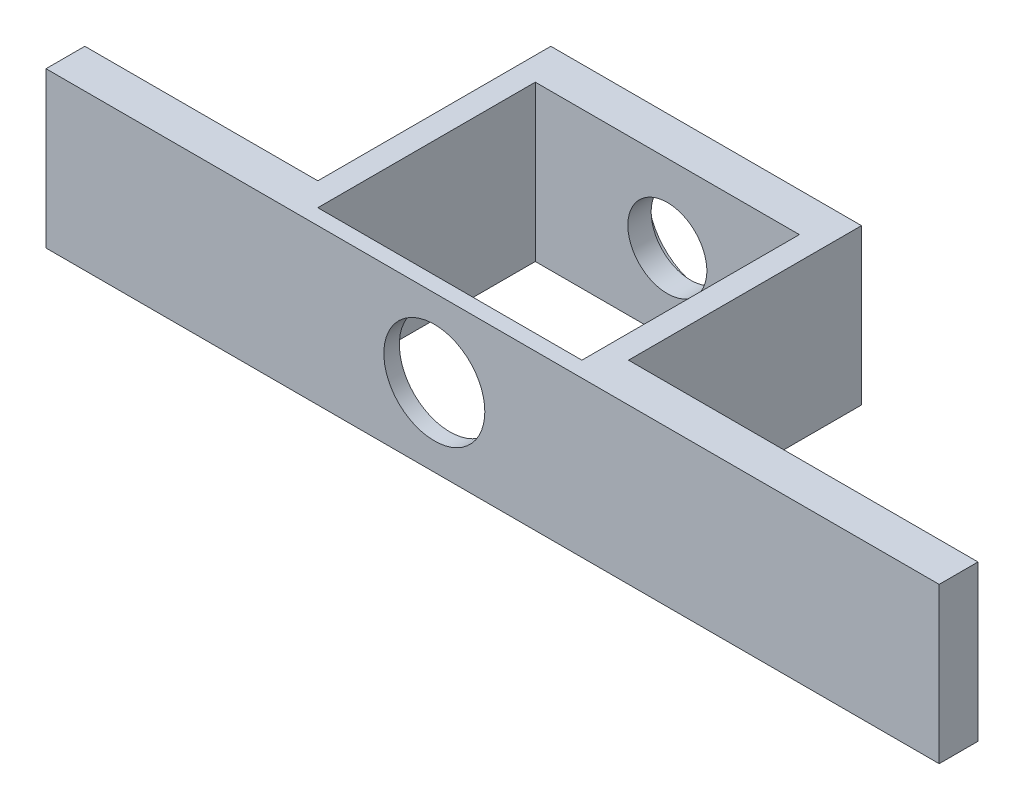
ISO-10303-21;
HEADER;
FILE_DESCRIPTION(('STEP AP214'),'2;1');
FILE_NAME('part.step','',(''),(''),'','','');
FILE_SCHEMA(('AUTOMOTIVE_DESIGN { 1 0 10303 214 1 1 1 1 }'));
ENDSEC;
DATA;
#1=APPLICATION_CONTEXT('core data for automotive mechanical design processes');
#2=APPLICATION_PROTOCOL_DEFINITION('international standard','automotive_design',2000,#1);
#3=PRODUCT_CONTEXT('',#1,'mechanical');
#4=PRODUCT('Part','Part','',(#3));
#5=PRODUCT_RELATED_PRODUCT_CATEGORY('part','',(#4));
#6=PRODUCT_DEFINITION_FORMATION('','',#4);
#7=PRODUCT_DEFINITION_CONTEXT('part definition',#1,'design');
#8=PRODUCT_DEFINITION('design','',#6,#7);
#9=PRODUCT_DEFINITION_SHAPE('','',#8);
#10=(LENGTH_UNIT() NAMED_UNIT(*) SI_UNIT(.MILLI.,.METRE.));
#11=(NAMED_UNIT(*) PLANE_ANGLE_UNIT() SI_UNIT($,.RADIAN.));
#12=(NAMED_UNIT(*) SI_UNIT($,.STERADIAN.) SOLID_ANGLE_UNIT());
#13=UNCERTAINTY_MEASURE_WITH_UNIT(LENGTH_MEASURE(1.E-05),#10,'distance_accuracy_value','');
#14=(GEOMETRIC_REPRESENTATION_CONTEXT(3) GLOBAL_UNCERTAINTY_ASSIGNED_CONTEXT((#13)) GLOBAL_UNIT_ASSIGNED_CONTEXT((#10,
#11,#12)) REPRESENTATION_CONTEXT('',''));
#15=CARTESIAN_POINT('',(0.,0.,0.));
#16=DIRECTION('',(0.,0.,1.));
#17=DIRECTION('',(1.,0.,0.));
#18=AXIS2_PLACEMENT_3D('',#15,#16,#17);
#19=CARTESIAN_POINT('',(-17.,10.,35.));
#20=DIRECTION('',(-1.,0.,0.));
#21=DIRECTION('',(0.,-1.,0.));
#22=AXIS2_PLACEMENT_3D('',#19,#20,#21);
#23=PLANE('',#22);
#24=DIRECTION('',(0.,-1.,0.));
#25=VECTOR('',#24,1.);
#26=CARTESIAN_POINT('',(-17.,10.,33.));
#27=LINE('',#26,#25);
#28=CARTESIAN_POINT('',(-17.,10.,33.));
#29=VERTEX_POINT('',#28);
#30=CARTESIAN_POINT('',(-17.,-10.,33.));
#31=VERTEX_POINT('',#30);
#32=EDGE_CURVE('E126',#29,#31,#27,.T.);
#33=ORIENTED_EDGE('',*,*,#32,.T.);
#34=DIRECTION('',(0.,0.,-1.));
#35=VECTOR('',#34,1.);
#36=CARTESIAN_POINT('',(-17.,-10.,35.));
#37=LINE('',#36,#35);
#38=CARTESIAN_POINT('',(-17.,-10.,5.));
#39=VERTEX_POINT('',#38);
#40=EDGE_CURVE('E137',#31,#39,#37,.T.);
#41=ORIENTED_EDGE('',*,*,#40,.T.);
#42=DIRECTION('',(0.,1.,0.));
#43=VECTOR('',#42,1.);
#44=CARTESIAN_POINT('',(-17.,10.,5.));
#45=LINE('',#44,#43);
#46=CARTESIAN_POINT('',(-17.,10.,5.));
#47=VERTEX_POINT('',#46);
#48=EDGE_CURVE('E229',#39,#47,#45,.T.);
#49=ORIENTED_EDGE('',*,*,#48,.T.);
#50=DIRECTION('',(0.,0.,-1.));
#51=VECTOR('',#50,1.);
#52=CARTESIAN_POINT('',(-17.,10.,35.));
#53=LINE('',#52,#51);
#54=EDGE_CURVE('E139',#29,#47,#53,.T.);
#55=ORIENTED_EDGE('',*,*,#54,.F.);
#56=EDGE_LOOP('',(#33,#41,#49,#55));
#57=FACE_BOUND('',#56,.T.);
#58=ADVANCED_FACE('F35',(#57),#23,.F.);
#59=CARTESIAN_POINT('',(17.,10.,35.));
#60=DIRECTION('',(1.,0.,0.));
#61=DIRECTION('',(0.,1.,0.));
#62=AXIS2_PLACEMENT_3D('',#59,#60,#61);
#63=PLANE('',#62);
#64=DIRECTION('',(0.,1.,0.));
#65=VECTOR('',#64,1.);
#66=CARTESIAN_POINT('',(17.,10.,33.));
#67=LINE('',#66,#65);
#68=CARTESIAN_POINT('',(17.,-10.,33.));
#69=VERTEX_POINT('',#68);
#70=CARTESIAN_POINT('',(17.,10.,33.));
#71=VERTEX_POINT('',#70);
#72=EDGE_CURVE('E129',#69,#71,#67,.T.);
#73=ORIENTED_EDGE('',*,*,#72,.T.);
#74=DIRECTION('',(0.,0.,-1.));
#75=VECTOR('',#74,1.);
#76=CARTESIAN_POINT('',(17.,10.,35.));
#77=LINE('',#76,#75);
#78=CARTESIAN_POINT('',(17.,10.,5.));
#79=VERTEX_POINT('',#78);
#80=EDGE_CURVE('E227',#71,#79,#77,.T.);
#81=ORIENTED_EDGE('',*,*,#80,.T.);
#82=DIRECTION('',(0.,-1.,0.));
#83=VECTOR('',#82,1.);
#84=CARTESIAN_POINT('',(17.,10.,5.));
#85=LINE('',#84,#83);
#86=CARTESIAN_POINT('',(17.,-10.,5.));
#87=VERTEX_POINT('',#86);
#88=EDGE_CURVE('E222',#79,#87,#85,.T.);
#89=ORIENTED_EDGE('',*,*,#88,.T.);
#90=DIRECTION('',(0.,0.,-1.));
#91=VECTOR('',#90,1.);
#92=CARTESIAN_POINT('',(17.,-10.,35.));
#93=LINE('',#92,#91);
#94=EDGE_CURVE('E225',#69,#87,#93,.T.);
#95=ORIENTED_EDGE('',*,*,#94,.F.);
#96=EDGE_LOOP('',(#73,#81,#89,#95));
#97=FACE_BOUND('',#96,.T.);
#98=ADVANCED_FACE('F239',(#97),#63,.F.);
#99=CARTESIAN_POINT('',(-20.,-10.,5.));
#100=DIRECTION('',(1.,0.,0.));
#101=DIRECTION('',(0.,0.,-1.));
#102=AXIS2_PLACEMENT_3D('',#99,#100,#101);
#103=PLANE('',#102);
#104=DIRECTION('',(0.,-1.,0.));
#105=VECTOR('',#104,1.);
#106=CARTESIAN_POINT('',(-20.,10.,30.));
#107=LINE('',#106,#105);
#108=CARTESIAN_POINT('',(-20.,10.,30.));
#109=VERTEX_POINT('',#108);
#110=CARTESIAN_POINT('',(-20.,-10.,30.));
#111=VERTEX_POINT('',#110);
#112=EDGE_CURVE('E51',#109,#111,#107,.T.);
#113=ORIENTED_EDGE('',*,*,#112,.F.);
#114=DIRECTION('',(0.,0.,-1.));
#115=VECTOR('',#114,1.);
#116=CARTESIAN_POINT('',(-20.,10.,5.));
#117=LINE('',#116,#115);
#118=CARTESIAN_POINT('',(-20.,10.,0.));
#119=VERTEX_POINT('',#118);
#120=EDGE_CURVE('E44',#109,#119,#117,.T.);
#121=ORIENTED_EDGE('',*,*,#120,.T.);
#122=DIRECTION('',(0.,-1.,0.));
#123=VECTOR('',#122,1.);
#124=CARTESIAN_POINT('',(-20.,-10.,0.));
#125=LINE('',#124,#123);
#126=CARTESIAN_POINT('',(-20.,-10.,0.));
#127=VERTEX_POINT('',#126);
#128=EDGE_CURVE('E164',#119,#127,#125,.T.);
#129=ORIENTED_EDGE('',*,*,#128,.T.);
#130=DIRECTION('',(0.,0.,-1.));
#131=VECTOR('',#130,1.);
#132=CARTESIAN_POINT('',(-20.,-10.,5.));
#133=LINE('',#132,#131);
#134=EDGE_CURVE('E170',#111,#127,#133,.T.);
#135=ORIENTED_EDGE('',*,*,#134,.F.);
#136=EDGE_LOOP('',(#113,#121,#129,#135));
#137=FACE_BOUND('',#136,.T.);
#138=ADVANCED_FACE('F172',(#137),#103,.F.);
#139=CARTESIAN_POINT('',(20.,-10.,5.));
#140=DIRECTION('',(-1.,0.,0.));
#141=DIRECTION('',(0.,0.,1.));
#142=AXIS2_PLACEMENT_3D('',#139,#140,#141);
#143=PLANE('',#142);
#144=DIRECTION('',(0.,1.,0.));
#145=VECTOR('',#144,1.);
#146=CARTESIAN_POINT('',(20.,10.,30.));
#147=LINE('',#146,#145);
#148=CARTESIAN_POINT('',(20.,-10.,30.));
#149=VERTEX_POINT('',#148);
#150=CARTESIAN_POINT('',(20.,10.,30.));
#151=VERTEX_POINT('',#150);
#152=EDGE_CURVE('E59',#149,#151,#147,.T.);
#153=ORIENTED_EDGE('',*,*,#152,.F.);
#154=DIRECTION('',(0.,0.,-1.));
#155=VECTOR('',#154,1.);
#156=CARTESIAN_POINT('',(20.,-10.,5.));
#157=LINE('',#156,#155);
#158=CARTESIAN_POINT('',(20.,-10.,0.));
#159=VERTEX_POINT('',#158);
#160=EDGE_CURVE('E160',#149,#159,#157,.T.);
#161=ORIENTED_EDGE('',*,*,#160,.T.);
#162=DIRECTION('',(0.,1.,0.));
#163=VECTOR('',#162,1.);
#164=CARTESIAN_POINT('',(20.,-10.,0.));
#165=LINE('',#164,#163);
#166=CARTESIAN_POINT('',(20.,10.,0.));
#167=VERTEX_POINT('',#166);
#168=EDGE_CURVE('E147',#159,#167,#165,.T.);
#169=ORIENTED_EDGE('',*,*,#168,.T.);
#170=DIRECTION('',(0.,0.,-1.));
#171=VECTOR('',#170,1.);
#172=CARTESIAN_POINT('',(20.,10.,5.));
#173=LINE('',#172,#171);
#174=EDGE_CURVE('E11',#151,#167,#173,.T.);
#175=ORIENTED_EDGE('',*,*,#174,.F.);
#176=EDGE_LOOP('',(#153,#161,#169,#175));
#177=FACE_BOUND('',#176,.T.);
#178=ADVANCED_FACE('F37',(#177),#143,.F.);
#179=CARTESIAN_POINT('',(0.,0.,5.));
#180=DIRECTION('',(0.,0.,-1.));
#181=DIRECTION('',(-1.,0.,0.));
#182=AXIS2_PLACEMENT_3D('',#179,#180,#181);
#183=PLANE('',#182);
#184=CARTESIAN_POINT('',(0.,0.,5.));
#185=DIRECTION('',(0.,0.,-1.));
#186=DIRECTION('',(-1.,0.,0.));
#187=AXIS2_PLACEMENT_3D('',#184,#185,#186);
#188=CIRCLE('',#187,5.08551448818072);
#189=CARTESIAN_POINT('',(-5.08551448818072,0.,5.));
#190=VERTEX_POINT('',#189);
#191=EDGE_CURVE('E467',#190,#190,#188,.T.);
#192=ORIENTED_EDGE('',*,*,#191,.T.);
#193=EDGE_LOOP('',(#192));
#194=FACE_BOUND('',#193,.T.);
#195=ORIENTED_EDGE('',*,*,#88,.F.);
#196=DIRECTION('',(-1.,0.,0.));
#197=VECTOR('',#196,1.);
#198=CARTESIAN_POINT('',(-20.,10.,5.));
#199=LINE('',#198,#197);
#200=EDGE_CURVE('E156',#79,#47,#199,.T.);
#201=ORIENTED_EDGE('',*,*,#200,.T.);
#202=ORIENTED_EDGE('',*,*,#48,.F.);
#203=DIRECTION('',(1.,0.,0.));
#204=VECTOR('',#203,1.);
#205=CARTESIAN_POINT('',(-20.,-10.,5.));
#206=LINE('',#205,#204);
#207=EDGE_CURVE('E146',#39,#87,#206,.T.);
#208=ORIENTED_EDGE('',*,*,#207,.T.);
#209=EDGE_LOOP('',(#195,#201,#202,#208));
#210=FACE_BOUND('',#209,.T.);
#211=ADVANCED_FACE('F234',(#194,#210),#183,.F.);
#212=CARTESIAN_POINT('',(-20.,10.,5.));
#213=DIRECTION('',(0.,-1.,0.));
#214=DIRECTION('',(0.,0.,-1.));
#215=AXIS2_PLACEMENT_3D('',#212,#213,#214);
#216=PLANE('',#215);
#217=DIRECTION('',(-1.,0.,0.));
#218=VECTOR('',#217,1.);
#219=CARTESIAN_POINT('',(-17.,10.,33.));
#220=LINE('',#219,#218);
#221=EDGE_CURVE('E195',#71,#29,#220,.T.);
#222=ORIENTED_EDGE('',*,*,#221,.T.);
#223=ORIENTED_EDGE('',*,*,#54,.T.);
#224=ORIENTED_EDGE('',*,*,#200,.F.);
#225=ORIENTED_EDGE('',*,*,#80,.F.);
#226=EDGE_LOOP('',(#222,#223,#224,#225));
#227=FACE_BOUND('',#226,.T.);
#228=DIRECTION('',(-1.,0.,0.));
#229=VECTOR('',#228,1.);
#230=CARTESIAN_POINT('',(-20.,10.,0.));
#231=LINE('',#230,#229);
#232=EDGE_CURVE('E150',#167,#119,#231,.T.);
#233=ORIENTED_EDGE('',*,*,#232,.T.);
#234=ORIENTED_EDGE('',*,*,#120,.F.);
#235=DIRECTION('',(1.,0.,0.));
#236=VECTOR('',#235,1.);
#237=CARTESIAN_POINT('',(-50.,10.,30.));
#238=LINE('',#237,#236);
#239=CARTESIAN_POINT('',(-50.,10.,30.));
#240=VERTEX_POINT('',#239);
#241=EDGE_CURVE('E193',#240,#109,#238,.T.);
#242=ORIENTED_EDGE('',*,*,#241,.F.);
#243=DIRECTION('',(0.,0.,-1.));
#244=VECTOR('',#243,1.);
#245=CARTESIAN_POINT('',(-50.,10.,35.));
#246=LINE('',#245,#244);
#247=CARTESIAN_POINT('',(-50.,10.,35.));
#248=VERTEX_POINT('',#247);
#249=EDGE_CURVE('E198',#248,#240,#246,.T.);
#250=ORIENTED_EDGE('',*,*,#249,.F.);
#251=DIRECTION('',(-1.,0.,0.));
#252=VECTOR('',#251,1.);
#253=CARTESIAN_POINT('',(-20.,10.,35.));
#254=LINE('',#253,#252);
#255=CARTESIAN_POINT('',(65.,10.,35.));
#256=VERTEX_POINT('',#255);
#257=EDGE_CURVE('E152',#256,#248,#254,.T.);
#258=ORIENTED_EDGE('',*,*,#257,.F.);
#259=DIRECTION('',(0.,0.,1.));
#260=VECTOR('',#259,1.);
#261=CARTESIAN_POINT('',(65.,10.,35.));
#262=LINE('',#261,#260);
#263=CARTESIAN_POINT('',(65.,10.,30.));
#264=VERTEX_POINT('',#263);
#265=EDGE_CURVE('E214',#264,#256,#262,.T.);
#266=ORIENTED_EDGE('',*,*,#265,.F.);
#267=DIRECTION('',(-1.,0.,0.));
#268=VECTOR('',#267,1.);
#269=CARTESIAN_POINT('',(65.,10.,30.));
#270=LINE('',#269,#268);
#271=EDGE_CURVE('E217',#264,#151,#270,.T.);
#272=ORIENTED_EDGE('',*,*,#271,.T.);
#273=ORIENTED_EDGE('',*,*,#174,.T.);
#274=EDGE_LOOP('',(#233,#234,#242,#250,#258,#266,#272,#273));
#275=FACE_BOUND('',#274,.T.);
#276=ADVANCED_FACE('F179',(#227,#275),#216,.F.);
#277=CARTESIAN_POINT('',(-20.,-10.,5.));
#278=DIRECTION('',(0.,1.,0.));
#279=DIRECTION('',(0.,0.,1.));
#280=AXIS2_PLACEMENT_3D('',#277,#278,#279);
#281=PLANE('',#280);
#282=ORIENTED_EDGE('',*,*,#40,.F.);
#283=DIRECTION('',(1.,0.,0.));
#284=VECTOR('',#283,1.);
#285=CARTESIAN_POINT('',(-17.,-10.,33.));
#286=LINE('',#285,#284);
#287=EDGE_CURVE('E123',#31,#69,#286,.T.);
#288=ORIENTED_EDGE('',*,*,#287,.T.);
#289=ORIENTED_EDGE('',*,*,#94,.T.);
#290=ORIENTED_EDGE('',*,*,#207,.F.);
#291=EDGE_LOOP('',(#282,#288,#289,#290));
#292=FACE_BOUND('',#291,.T.);
#293=DIRECTION('',(1.,0.,0.));
#294=VECTOR('',#293,1.);
#295=CARTESIAN_POINT('',(-20.,-10.,0.));
#296=LINE('',#295,#294);
#297=EDGE_CURVE('E159',#127,#159,#296,.T.);
#298=ORIENTED_EDGE('',*,*,#297,.T.);
#299=ORIENTED_EDGE('',*,*,#160,.F.);
#300=DIRECTION('',(-1.,0.,0.));
#301=VECTOR('',#300,1.);
#302=CARTESIAN_POINT('',(65.,-10.,30.));
#303=LINE('',#302,#301);
#304=CARTESIAN_POINT('',(65.,-10.,30.));
#305=VERTEX_POINT('',#304);
#306=EDGE_CURVE('E220',#305,#149,#303,.T.);
#307=ORIENTED_EDGE('',*,*,#306,.F.);
#308=DIRECTION('',(0.,0.,-1.));
#309=VECTOR('',#308,1.);
#310=CARTESIAN_POINT('',(65.,-10.,35.));
#311=LINE('',#310,#309);
#312=CARTESIAN_POINT('',(65.,-10.,35.));
#313=VERTEX_POINT('',#312);
#314=EDGE_CURVE('E210',#313,#305,#311,.T.);
#315=ORIENTED_EDGE('',*,*,#314,.F.);
#316=DIRECTION('',(1.,0.,0.));
#317=VECTOR('',#316,1.);
#318=CARTESIAN_POINT('',(-20.,-10.,35.));
#319=LINE('',#318,#317);
#320=CARTESIAN_POINT('',(-50.,-10.,35.));
#321=VERTEX_POINT('',#320);
#322=EDGE_CURVE('E230',#321,#313,#319,.T.);
#323=ORIENTED_EDGE('',*,*,#322,.F.);
#324=DIRECTION('',(0.,0.,1.));
#325=VECTOR('',#324,1.);
#326=CARTESIAN_POINT('',(-50.,-10.,35.));
#327=LINE('',#326,#325);
#328=CARTESIAN_POINT('',(-50.,-10.,30.));
#329=VERTEX_POINT('',#328);
#330=EDGE_CURVE('E203',#329,#321,#327,.T.);
#331=ORIENTED_EDGE('',*,*,#330,.F.);
#332=DIRECTION('',(1.,0.,0.));
#333=VECTOR('',#332,1.);
#334=CARTESIAN_POINT('',(-50.,-10.,30.));
#335=LINE('',#334,#333);
#336=EDGE_CURVE('E189',#329,#111,#335,.T.);
#337=ORIENTED_EDGE('',*,*,#336,.T.);
#338=ORIENTED_EDGE('',*,*,#134,.T.);
#339=EDGE_LOOP('',(#298,#299,#307,#315,#323,#331,#337,#338));
#340=FACE_BOUND('',#339,.T.);
#341=ADVANCED_FACE('F143',(#292,#340),#281,.F.);
#342=CARTESIAN_POINT('',(0.,0.,0.));
#343=DIRECTION('',(0.,0.,-1.));
#344=DIRECTION('',(-1.,0.,0.));
#345=AXIS2_PLACEMENT_3D('',#342,#343,#344);
#346=PLANE('',#345);
#347=CARTESIAN_POINT('',(0.,0.,0.));
#348=DIRECTION('',(0.,0.,-1.));
#349=DIRECTION('',(-1.,0.,0.));
#350=AXIS2_PLACEMENT_3D('',#347,#348,#349);
#351=CIRCLE('',#350,7.5);
#352=CARTESIAN_POINT('',(-7.5,0.,0.));
#353=VERTEX_POINT('',#352);
#354=EDGE_CURVE('E466',#353,#353,#351,.T.);
#355=ORIENTED_EDGE('',*,*,#354,.F.);
#356=EDGE_LOOP('',(#355));
#357=FACE_BOUND('',#356,.T.);
#358=ORIENTED_EDGE('',*,*,#168,.F.);
#359=ORIENTED_EDGE('',*,*,#297,.F.);
#360=ORIENTED_EDGE('',*,*,#128,.F.);
#361=ORIENTED_EDGE('',*,*,#232,.F.);
#362=EDGE_LOOP('',(#358,#359,#360,#361));
#363=FACE_BOUND('',#362,.T.);
#364=ADVANCED_FACE('F183',(#357,#363),#346,.T.);
#365=CARTESIAN_POINT('',(0.,0.,35.));
#366=DIRECTION('',(0.,0.,1.));
#367=DIRECTION('',(1.,0.,0.));
#368=AXIS2_PLACEMENT_3D('',#365,#366,#367);
#369=PLANE('',#368);
#370=CARTESIAN_POINT('',(0.,0.,35.));
#371=DIRECTION('',(0.,0.,1.));
#372=DIRECTION('',(1.,0.,0.));
#373=AXIS2_PLACEMENT_3D('',#370,#371,#372);
#374=CIRCLE('',#373,6.5);
#375=CARTESIAN_POINT('',(6.5,0.,35.));
#376=VERTEX_POINT('',#375);
#377=EDGE_CURVE('E476',#376,#376,#374,.T.);
#378=ORIENTED_EDGE('',*,*,#377,.F.);
#379=EDGE_LOOP('',(#378));
#380=FACE_BOUND('',#379,.T.);
#381=ORIENTED_EDGE('',*,*,#257,.T.);
#382=DIRECTION('',(0.,1.,0.));
#383=VECTOR('',#382,1.);
#384=CARTESIAN_POINT('',(-50.,10.,35.));
#385=LINE('',#384,#383);
#386=EDGE_CURVE('E194',#321,#248,#385,.T.);
#387=ORIENTED_EDGE('',*,*,#386,.F.);
#388=ORIENTED_EDGE('',*,*,#322,.T.);
#389=DIRECTION('',(0.,-1.,0.));
#390=VECTOR('',#389,1.);
#391=CARTESIAN_POINT('',(65.,10.,35.));
#392=LINE('',#391,#390);
#393=EDGE_CURVE('E207',#256,#313,#392,.T.);
#394=ORIENTED_EDGE('',*,*,#393,.F.);
#395=EDGE_LOOP('',(#381,#387,#388,#394));
#396=FACE_BOUND('',#395,.T.);
#397=ADVANCED_FACE('F248',(#380,#396),#369,.T.);
#398=CARTESIAN_POINT('',(65.,10.,30.));
#399=DIRECTION('',(0.,0.,1.));
#400=DIRECTION('',(0.,-1.,0.));
#401=AXIS2_PLACEMENT_3D('',#398,#399,#400);
#402=PLANE('',#401);
#403=ORIENTED_EDGE('',*,*,#152,.T.);
#404=ORIENTED_EDGE('',*,*,#271,.F.);
#405=DIRECTION('',(0.,1.,0.));
#406=VECTOR('',#405,1.);
#407=CARTESIAN_POINT('',(65.,10.,30.));
#408=LINE('',#407,#406);
#409=EDGE_CURVE('E212',#305,#264,#408,.T.);
#410=ORIENTED_EDGE('',*,*,#409,.F.);
#411=ORIENTED_EDGE('',*,*,#306,.T.);
#412=EDGE_LOOP('',(#403,#404,#410,#411));
#413=FACE_BOUND('',#412,.T.);
#414=ADVANCED_FACE('F258',(#413),#402,.F.);
#415=CARTESIAN_POINT('',(65.,0.,0.));
#416=DIRECTION('',(1.,0.,0.));
#417=DIRECTION('',(0.,0.,-1.));
#418=AXIS2_PLACEMENT_3D('',#415,#416,#417);
#419=PLANE('',#418);
#420=ORIENTED_EDGE('',*,*,#393,.T.);
#421=ORIENTED_EDGE('',*,*,#314,.T.);
#422=ORIENTED_EDGE('',*,*,#409,.T.);
#423=ORIENTED_EDGE('',*,*,#265,.T.);
#424=EDGE_LOOP('',(#420,#421,#422,#423));
#425=FACE_BOUND('',#424,.T.);
#426=ADVANCED_FACE('F254',(#425),#419,.T.);
#427=CARTESIAN_POINT('',(-50.,10.,30.));
#428=DIRECTION('',(0.,0.,1.));
#429=DIRECTION('',(0.,-1.,0.));
#430=AXIS2_PLACEMENT_3D('',#427,#428,#429);
#431=PLANE('',#430);
#432=ORIENTED_EDGE('',*,*,#112,.T.);
#433=ORIENTED_EDGE('',*,*,#336,.F.);
#434=DIRECTION('',(0.,-1.,0.));
#435=VECTOR('',#434,1.);
#436=CARTESIAN_POINT('',(-50.,10.,30.));
#437=LINE('',#436,#435);
#438=EDGE_CURVE('E242',#240,#329,#437,.T.);
#439=ORIENTED_EDGE('',*,*,#438,.F.);
#440=ORIENTED_EDGE('',*,*,#241,.T.);
#441=EDGE_LOOP('',(#432,#433,#439,#440));
#442=FACE_BOUND('',#441,.T.);
#443=ADVANCED_FACE('F191',(#442),#431,.F.);
#444=CARTESIAN_POINT('',(-50.,0.,0.));
#445=DIRECTION('',(1.,0.,0.));
#446=DIRECTION('',(0.,0.,-1.));
#447=AXIS2_PLACEMENT_3D('',#444,#445,#446);
#448=PLANE('',#447);
#449=ORIENTED_EDGE('',*,*,#386,.T.);
#450=ORIENTED_EDGE('',*,*,#249,.T.);
#451=ORIENTED_EDGE('',*,*,#438,.T.);
#452=ORIENTED_EDGE('',*,*,#330,.T.);
#453=EDGE_LOOP('',(#449,#450,#451,#452));
#454=FACE_BOUND('',#453,.T.);
#455=ADVANCED_FACE('F246',(#454),#448,.F.);
#456=CARTESIAN_POINT('',(0.,0.,33.));
#457=DIRECTION('',(0.,0.,1.));
#458=DIRECTION('',(1.,0.,0.));
#459=AXIS2_PLACEMENT_3D('',#456,#457,#458);
#460=PLANE('',#459);
#461=CARTESIAN_POINT('',(0.,0.,33.));
#462=DIRECTION('',(0.,0.,1.));
#463=DIRECTION('',(1.,0.,0.));
#464=AXIS2_PLACEMENT_3D('',#461,#462,#463);
#465=CIRCLE('',#464,6.5);
#466=CARTESIAN_POINT('',(6.5,0.,33.));
#467=VERTEX_POINT('',#466);
#468=EDGE_CURVE('E39',#467,#467,#465,.T.);
#469=ORIENTED_EDGE('',*,*,#468,.T.);
#470=EDGE_LOOP('',(#469));
#471=FACE_BOUND('',#470,.T.);
#472=ORIENTED_EDGE('',*,*,#32,.F.);
#473=ORIENTED_EDGE('',*,*,#221,.F.);
#474=ORIENTED_EDGE('',*,*,#72,.F.);
#475=ORIENTED_EDGE('',*,*,#287,.F.);
#476=EDGE_LOOP('',(#472,#473,#474,#475));
#477=FACE_BOUND('',#476,.T.);
#478=ADVANCED_FACE('F125',(#471,#477),#460,.F.);
#479=CARTESIAN_POINT('',(0.,0.,2.));
#480=DIRECTION('',(0.,0.,-1.));
#481=DIRECTION('',(-1.,0.,0.));
#482=AXIS2_PLACEMENT_3D('',#479,#480,#481);
#483=CYLINDRICAL_SURFACE('',#482,7.5);
#484=CARTESIAN_POINT('',(0.,0.,2.));
#485=DIRECTION('',(0.,0.,-1.));
#486=DIRECTION('',(-1.,0.,0.));
#487=AXIS2_PLACEMENT_3D('',#484,#485,#486);
#488=CIRCLE('',#487,7.5);
#489=CARTESIAN_POINT('',(-7.5,0.,2.));
#490=VERTEX_POINT('',#489);
#491=EDGE_CURVE('E140',#490,#490,#488,.T.);
#492=ORIENTED_EDGE('',*,*,#491,.F.);
#493=EDGE_LOOP('',(#492));
#494=FACE_BOUND('',#493,.T.);
#495=ORIENTED_EDGE('',*,*,#354,.T.);
#496=EDGE_LOOP('',(#495));
#497=FACE_BOUND('',#496,.T.);
#498=ADVANCED_FACE('F320',(#494,#497),#483,.F.);
#499=CARTESIAN_POINT('',(0.,0.,2.));
#500=DIRECTION('',(0.,0.,-1.));
#501=DIRECTION('',(-1.,0.,0.));
#502=AXIS2_PLACEMENT_3D('',#499,#500,#501);
#503=PLANE('',#502);
#504=CARTESIAN_POINT('',(0.,0.,2.));
#505=DIRECTION('',(0.,0.,-1.));
#506=DIRECTION('',(-1.,0.,0.));
#507=AXIS2_PLACEMENT_3D('',#504,#505,#506);
#508=CIRCLE('',#507,5.08551448818072);
#509=CARTESIAN_POINT('',(-5.08551448818072,0.,2.));
#510=VERTEX_POINT('',#509);
#511=EDGE_CURVE('E471',#510,#510,#508,.T.);
#512=ORIENTED_EDGE('',*,*,#511,.F.);
#513=EDGE_LOOP('',(#512));
#514=FACE_BOUND('',#513,.T.);
#515=ORIENTED_EDGE('',*,*,#491,.T.);
#516=EDGE_LOOP('',(#515));
#517=FACE_BOUND('',#516,.T.);
#518=ADVANCED_FACE('F340',(#514,#517),#503,.T.);
#519=CARTESIAN_POINT('',(0.,0.,7.));
#520=DIRECTION('',(0.,0.,-1.));
#521=DIRECTION('',(-1.,0.,0.));
#522=AXIS2_PLACEMENT_3D('',#519,#520,#521);
#523=CYLINDRICAL_SURFACE('',#522,5.08551448818072);
#524=ORIENTED_EDGE('',*,*,#511,.T.);
#525=EDGE_LOOP('',(#524));
#526=FACE_BOUND('',#525,.T.);
#527=ORIENTED_EDGE('',*,*,#191,.F.);
#528=EDGE_LOOP('',(#527));
#529=FACE_BOUND('',#528,.T.);
#530=ADVANCED_FACE('F312',(#526,#529),#523,.F.);
#531=CARTESIAN_POINT('',(0.,0.,22.));
#532=DIRECTION('',(0.,0.,1.));
#533=DIRECTION('',(1.,0.,0.));
#534=AXIS2_PLACEMENT_3D('',#531,#532,#533);
#535=CYLINDRICAL_SURFACE('',#534,6.5);
#536=CARTESIAN_POINT('',(6.5,0.,35.));
#537=CARTESIAN_POINT('',(6.5,0.,34.9791666666667));
#538=CARTESIAN_POINT('',(6.5,0.,34.9583333333333));
#539=CARTESIAN_POINT('',(6.5,0.,34.9166666666667));
#540=CARTESIAN_POINT('',(6.5,0.,34.8958333333333));
#541=CARTESIAN_POINT('',(6.5,0.,34.8541666666667));
#542=CARTESIAN_POINT('',(6.5,0.,34.8333333333333));
#543=CARTESIAN_POINT('',(6.5,0.,34.7916666666667));
#544=CARTESIAN_POINT('',(6.5,0.,34.7708333333333));
#545=CARTESIAN_POINT('',(6.5,0.,34.7291666666667));
#546=CARTESIAN_POINT('',(6.5,0.,34.7083333333333));
#547=CARTESIAN_POINT('',(6.5,0.,34.6666666666667));
#548=CARTESIAN_POINT('',(6.5,0.,34.6458333333333));
#549=CARTESIAN_POINT('',(6.5,0.,34.6041666666667));
#550=CARTESIAN_POINT('',(6.5,0.,34.5833333333333));
#551=CARTESIAN_POINT('',(6.5,0.,34.5416666666667));
#552=CARTESIAN_POINT('',(6.5,0.,34.5208333333333));
#553=CARTESIAN_POINT('',(6.5,0.,34.4791666666667));
#554=CARTESIAN_POINT('',(6.5,0.,34.4583333333333));
#555=CARTESIAN_POINT('',(6.5,0.,34.4166666666667));
#556=CARTESIAN_POINT('',(6.5,0.,34.3958333333333));
#557=CARTESIAN_POINT('',(6.5,0.,34.3541666666667));
#558=CARTESIAN_POINT('',(6.5,0.,34.3333333333333));
#559=CARTESIAN_POINT('',(6.5,0.,34.2916666666667));
#560=CARTESIAN_POINT('',(6.5,0.,34.2708333333333));
#561=CARTESIAN_POINT('',(6.5,0.,34.2291666666667));
#562=CARTESIAN_POINT('',(6.5,0.,34.2083333333333));
#563=CARTESIAN_POINT('',(6.5,0.,34.1666666666667));
#564=CARTESIAN_POINT('',(6.5,0.,34.1458333333333));
#565=CARTESIAN_POINT('',(6.5,0.,34.1041666666667));
#566=CARTESIAN_POINT('',(6.5,0.,34.0833333333333));
#567=CARTESIAN_POINT('',(6.5,0.,34.0416666666667));
#568=CARTESIAN_POINT('',(6.5,0.,34.0208333333333));
#569=CARTESIAN_POINT('',(6.5,0.,33.9791666666667));
#570=CARTESIAN_POINT('',(6.5,0.,33.9583333333333));
#571=CARTESIAN_POINT('',(6.5,0.,33.9166666666667));
#572=CARTESIAN_POINT('',(6.5,0.,33.8958333333333));
#573=CARTESIAN_POINT('',(6.5,0.,33.8541666666667));
#574=CARTESIAN_POINT('',(6.5,0.,33.8333333333333));
#575=CARTESIAN_POINT('',(6.5,0.,33.7916666666667));
#576=CARTESIAN_POINT('',(6.5,0.,33.7708333333333));
#577=CARTESIAN_POINT('',(6.5,0.,33.7291666666667));
#578=CARTESIAN_POINT('',(6.5,0.,33.7083333333333));
#579=CARTESIAN_POINT('',(6.5,0.,33.6666666666667));
#580=CARTESIAN_POINT('',(6.5,0.,33.6458333333333));
#581=CARTESIAN_POINT('',(6.5,0.,33.6041666666667));
#582=CARTESIAN_POINT('',(6.5,0.,33.5833333333333));
#583=CARTESIAN_POINT('',(6.5,0.,33.5416666666667));
#584=CARTESIAN_POINT('',(6.5,0.,33.5208333333333));
#585=CARTESIAN_POINT('',(6.5,0.,33.4791666666667));
#586=CARTESIAN_POINT('',(6.5,0.,33.4583333333333));
#587=CARTESIAN_POINT('',(6.5,0.,33.4166666666667));
#588=CARTESIAN_POINT('',(6.5,0.,33.3958333333333));
#589=CARTESIAN_POINT('',(6.5,0.,33.3541666666667));
#590=CARTESIAN_POINT('',(6.5,0.,33.3333333333333));
#591=CARTESIAN_POINT('',(6.5,0.,33.2916666666667));
#592=CARTESIAN_POINT('',(6.5,0.,33.2708333333333));
#593=CARTESIAN_POINT('',(6.5,0.,33.2291666666667));
#594=CARTESIAN_POINT('',(6.5,0.,33.2083333333333));
#595=CARTESIAN_POINT('',(6.5,0.,33.1666666666667));
#596=CARTESIAN_POINT('',(6.5,0.,33.1458333333333));
#597=CARTESIAN_POINT('',(6.5,0.,33.1041666666667));
#598=CARTESIAN_POINT('',(6.5,0.,33.0833333333333));
#599=CARTESIAN_POINT('',(6.5,0.,33.0416666666667));
#600=CARTESIAN_POINT('',(6.5,0.,33.0208333333333));
#601=CARTESIAN_POINT('',(6.5,0.,33.));
#602=B_SPLINE_CURVE_WITH_KNOTS('',3,(#536,#537,#538,#539,#540,#541,#542,#543,#544,#545,#546,
#547,#548,#549,#550,#551,#552,#553,#554,#555,#556,#557,#558,#559,#560,#561,#562,#563,#564,#565,
#566,#567,#568,#569,#570,#571,#572,#573,#574,#575,#576,#577,#578,#579,#580,#581,#582,#583,#584,
#585,#586,#587,#588,#589,#590,#591,#592,#593,#594,#595,#596,#597,#598,#599,#600,#601),
.UNSPECIFIED.,.F.,.F.,(4,2,2,2,2,2,2,2,2,2,2,2,2,2,2,2,2,2,2,2,2,2,2,2,2,2,2,2,2,2,2,2,4),(0.,
0.0625000000000001,0.125,0.1875,0.25,0.3125,0.375,0.4375,0.5,0.5625,0.625000000000001,
0.687500000000001,0.750000000000001,0.812500000000001,0.875000000000001,0.937500000000001,1.,
1.0625,1.125,1.1875,1.25,1.3125,1.375,1.4375,1.5,1.5625,1.625,1.6875,1.75,1.8125,1.875,1.9375,
2.),.UNSPECIFIED.);
#603=EDGE_CURVE('BSEAM329',#376,#467,#602,.T.);
#604=ORIENTED_EDGE('',*,*,#377,.T.);
#605=ORIENTED_EDGE('',*,*,#468,.F.);
#606=ORIENTED_EDGE('',*,*,#603,.T.);
#607=ORIENTED_EDGE('',*,*,#603,.F.);
#608=EDGE_LOOP('',(#604,#606,#605,#607));
#609=FACE_BOUND('',#608,.T.);
#610=ADVANCED_FACE('F329',(#609),#535,.F.);
#611=CLOSED_SHELL('',(#58,#98,#138,#178,#211,#276,#341,#364,#397,#414,#426,#443,#455,#478,#498,
#518,#530,#610));
#612=MANIFOLD_SOLID_BREP('B2',#611);
#613=ADVANCED_BREP_SHAPE_REPRESENTATION('',(#18,#612),#14);
#614=SHAPE_DEFINITION_REPRESENTATION(#9,#613);
ENDSEC;
END-ISO-10303-21;
